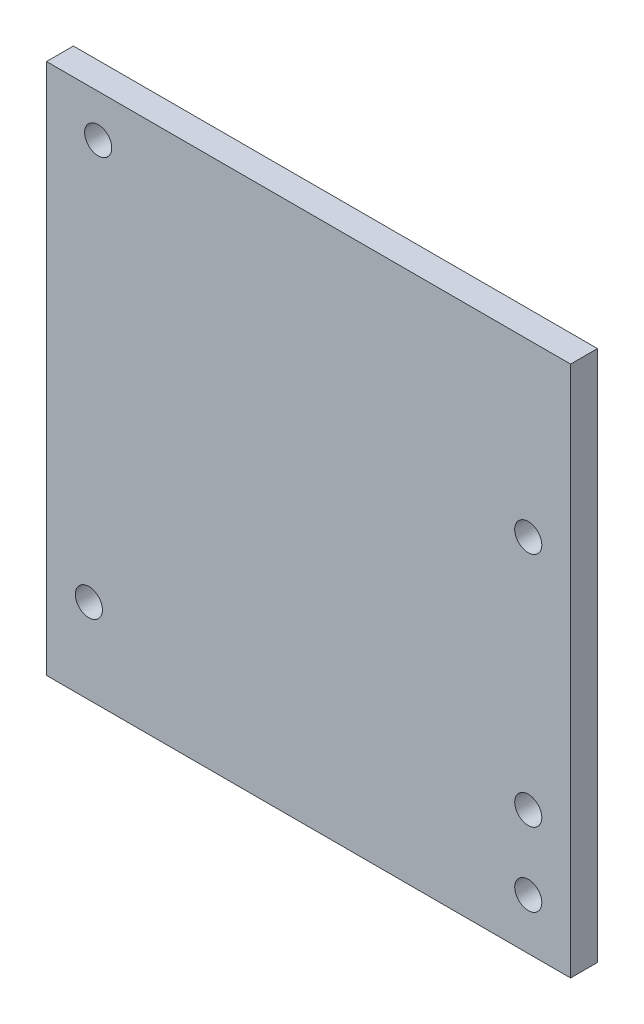
ISO-10303-21;
HEADER;
FILE_DESCRIPTION(('STEP AP214'),'2;1');
FILE_NAME('part.step','',(''),(''),'','','');
FILE_SCHEMA(('AUTOMOTIVE_DESIGN { 1 0 10303 214 1 1 1 1 }'));
ENDSEC;
DATA;
#1=APPLICATION_CONTEXT('core data for automotive mechanical design processes');
#2=APPLICATION_PROTOCOL_DEFINITION('international standard','automotive_design',2000,#1);
#3=PRODUCT_CONTEXT('',#1,'mechanical');
#4=PRODUCT('Part','Part','',(#3));
#5=PRODUCT_RELATED_PRODUCT_CATEGORY('part','',(#4));
#6=PRODUCT_DEFINITION_FORMATION('','',#4);
#7=PRODUCT_DEFINITION_CONTEXT('part definition',#1,'design');
#8=PRODUCT_DEFINITION('design','',#6,#7);
#9=PRODUCT_DEFINITION_SHAPE('','',#8);
#10=(LENGTH_UNIT() NAMED_UNIT(*) SI_UNIT(.MILLI.,.METRE.));
#11=(NAMED_UNIT(*) PLANE_ANGLE_UNIT() SI_UNIT($,.RADIAN.));
#12=(NAMED_UNIT(*) SI_UNIT($,.STERADIAN.) SOLID_ANGLE_UNIT());
#13=UNCERTAINTY_MEASURE_WITH_UNIT(LENGTH_MEASURE(1.E-05),#10,'distance_accuracy_value','');
#14=(GEOMETRIC_REPRESENTATION_CONTEXT(3) GLOBAL_UNCERTAINTY_ASSIGNED_CONTEXT((#13)) GLOBAL_UNIT_ASSIGNED_CONTEXT((#10,
#11,#12)) REPRESENTATION_CONTEXT('',''));
#15=CARTESIAN_POINT('',(0.,0.,0.));
#16=DIRECTION('',(0.,0.,1.));
#17=DIRECTION('',(1.,0.,0.));
#18=AXIS2_PLACEMENT_3D('',#15,#16,#17);
#19=CARTESIAN_POINT('',(0.,0.,3.175));
#20=DIRECTION('',(0.,0.,-1.));
#21=DIRECTION('',(-1.,0.,0.));
#22=AXIS2_PLACEMENT_3D('',#19,#20,#21);
#23=PLANE('',#22);
#24=DIRECTION('',(0.,-1.,0.));
#25=VECTOR('',#24,1.);
#26=CARTESIAN_POINT('',(0.,0.,3.175));
#27=LINE('',#26,#25);
#28=CARTESIAN_POINT('',(0.,62.8,3.175));
#29=VERTEX_POINT('',#28);
#30=CARTESIAN_POINT('',(0.,0.,3.175));
#31=VERTEX_POINT('',#30);
#32=EDGE_CURVE('E85',#29,#31,#27,.T.);
#33=ORIENTED_EDGE('',*,*,#32,.T.);
#34=DIRECTION('',(1.,0.,0.));
#35=VECTOR('',#34,1.);
#36=CARTESIAN_POINT('',(0.,0.,3.175));
#37=LINE('',#36,#35);
#38=CARTESIAN_POINT('',(61.9,0.,3.175));
#39=VERTEX_POINT('',#38);
#40=EDGE_CURVE('E80',#31,#39,#37,.T.);
#41=ORIENTED_EDGE('',*,*,#40,.T.);
#42=DIRECTION('',(0.,1.,0.));
#43=VECTOR('',#42,1.);
#44=CARTESIAN_POINT('',(61.9,0.,3.175));
#45=LINE('',#44,#43);
#46=CARTESIAN_POINT('',(61.9,62.8,3.175));
#47=VERTEX_POINT('',#46);
#48=EDGE_CURVE('E83',#39,#47,#45,.T.);
#49=ORIENTED_EDGE('',*,*,#48,.T.);
#50=DIRECTION('',(-1.,0.,0.));
#51=VECTOR('',#50,1.);
#52=CARTESIAN_POINT('',(0.,62.8,3.175));
#53=LINE('',#52,#51);
#54=EDGE_CURVE('E50',#47,#29,#53,.T.);
#55=ORIENTED_EDGE('',*,*,#54,.T.);
#56=EDGE_LOOP('',(#33,#41,#49,#55));
#57=FACE_BOUND('',#56,.T.);
#58=CARTESIAN_POINT('',(6.09999999999997,57.8,3.175));
#59=DIRECTION('',(0.,0.,1.));
#60=DIRECTION('',(1.,0.,0.));
#61=AXIS2_PLACEMENT_3D('',#58,#59,#60);
#62=CIRCLE('',#61,1.60000000000001);
#63=CARTESIAN_POINT('',(7.69999999999998,57.8,3.175));
#64=VERTEX_POINT('',#63);
#65=EDGE_CURVE('E100',#64,#64,#62,.T.);
#66=ORIENTED_EDGE('',*,*,#65,.F.);
#67=EDGE_LOOP('',(#66));
#68=FACE_BOUND('',#67,.T.);
#69=CARTESIAN_POINT('',(5.,10.,3.175));
#70=DIRECTION('',(0.,0.,1.));
#71=DIRECTION('',(1.,0.,0.));
#72=AXIS2_PLACEMENT_3D('',#69,#70,#71);
#73=CIRCLE('',#72,1.6);
#74=CARTESIAN_POINT('',(6.6,10.,3.175));
#75=VERTEX_POINT('',#74);
#76=EDGE_CURVE('E115',#75,#75,#73,.T.);
#77=ORIENTED_EDGE('',*,*,#76,.F.);
#78=EDGE_LOOP('',(#77));
#79=FACE_BOUND('',#78,.T.);
#80=CARTESIAN_POINT('',(56.9,42.6,3.175));
#81=DIRECTION('',(0.,0.,1.));
#82=DIRECTION('',(1.,0.,0.));
#83=AXIS2_PLACEMENT_3D('',#80,#81,#82);
#84=CIRCLE('',#83,1.60000000000001);
#85=CARTESIAN_POINT('',(58.5,42.6,3.175));
#86=VERTEX_POINT('',#85);
#87=EDGE_CURVE('E121',#86,#86,#84,.T.);
#88=ORIENTED_EDGE('',*,*,#87,.F.);
#89=EDGE_LOOP('',(#88));
#90=FACE_BOUND('',#89,.T.);
#91=CARTESIAN_POINT('',(56.9,14.7,3.175));
#92=DIRECTION('',(0.,0.,1.));
#93=DIRECTION('',(1.,0.,0.));
#94=AXIS2_PLACEMENT_3D('',#91,#92,#93);
#95=CIRCLE('',#94,1.6);
#96=CARTESIAN_POINT('',(58.5,14.7,3.175));
#97=VERTEX_POINT('',#96);
#98=EDGE_CURVE('E127',#97,#97,#95,.T.);
#99=ORIENTED_EDGE('',*,*,#98,.F.);
#100=EDGE_LOOP('',(#99));
#101=FACE_BOUND('',#100,.T.);
#102=CARTESIAN_POINT('',(56.9,6.,3.175));
#103=DIRECTION('',(0.,0.,1.));
#104=DIRECTION('',(1.,0.,0.));
#105=AXIS2_PLACEMENT_3D('',#102,#103,#104);
#106=CIRCLE('',#105,1.6);
#107=CARTESIAN_POINT('',(58.5,6.,3.175));
#108=VERTEX_POINT('',#107);
#109=EDGE_CURVE('E133',#108,#108,#106,.T.);
#110=ORIENTED_EDGE('',*,*,#109,.F.);
#111=EDGE_LOOP('',(#110));
#112=FACE_BOUND('',#111,.T.);
#113=ADVANCED_FACE('F33',(#57,#68,#79,#90,#101,#112),#23,.F.);
#114=CARTESIAN_POINT('',(0.,0.,0.));
#115=DIRECTION('',(0.,0.,-1.));
#116=DIRECTION('',(-1.,0.,0.));
#117=AXIS2_PLACEMENT_3D('',#114,#115,#116);
#118=PLANE('',#117);
#119=CARTESIAN_POINT('',(56.9,14.7,0.));
#120=DIRECTION('',(0.,0.,1.));
#121=DIRECTION('',(1.,0.,0.));
#122=AXIS2_PLACEMENT_3D('',#119,#120,#121);
#123=CIRCLE('',#122,1.6);
#124=CARTESIAN_POINT('',(58.5,14.7,0.));
#125=VERTEX_POINT('',#124);
#126=EDGE_CURVE('E130',#125,#125,#123,.T.);
#127=ORIENTED_EDGE('',*,*,#126,.T.);
#128=EDGE_LOOP('',(#127));
#129=FACE_BOUND('',#128,.T.);
#130=CARTESIAN_POINT('',(5.,10.,0.));
#131=DIRECTION('',(0.,0.,1.));
#132=DIRECTION('',(1.,0.,0.));
#133=AXIS2_PLACEMENT_3D('',#130,#131,#132);
#134=CIRCLE('',#133,1.6);
#135=CARTESIAN_POINT('',(6.6,10.,0.));
#136=VERTEX_POINT('',#135);
#137=EDGE_CURVE('E118',#136,#136,#134,.T.);
#138=ORIENTED_EDGE('',*,*,#137,.T.);
#139=EDGE_LOOP('',(#138));
#140=FACE_BOUND('',#139,.T.);
#141=DIRECTION('',(0.,-1.,0.));
#142=VECTOR('',#141,1.);
#143=CARTESIAN_POINT('',(0.,0.,0.));
#144=LINE('',#143,#142);
#145=CARTESIAN_POINT('',(0.,62.8,0.));
#146=VERTEX_POINT('',#145);
#147=CARTESIAN_POINT('',(0.,0.,0.));
#148=VERTEX_POINT('',#147);
#149=EDGE_CURVE('E97',#146,#148,#144,.T.);
#150=ORIENTED_EDGE('',*,*,#149,.F.);
#151=DIRECTION('',(-1.,0.,0.));
#152=VECTOR('',#151,1.);
#153=CARTESIAN_POINT('',(0.,62.8,0.));
#154=LINE('',#153,#152);
#155=CARTESIAN_POINT('',(61.9,62.8,0.));
#156=VERTEX_POINT('',#155);
#157=EDGE_CURVE('E73',#156,#146,#154,.T.);
#158=ORIENTED_EDGE('',*,*,#157,.F.);
#159=DIRECTION('',(0.,1.,0.));
#160=VECTOR('',#159,1.);
#161=CARTESIAN_POINT('',(61.9,0.,0.));
#162=LINE('',#161,#160);
#163=CARTESIAN_POINT('',(61.9,0.,0.));
#164=VERTEX_POINT('',#163);
#165=EDGE_CURVE('E67',#164,#156,#162,.T.);
#166=ORIENTED_EDGE('',*,*,#165,.F.);
#167=DIRECTION('',(1.,0.,0.));
#168=VECTOR('',#167,1.);
#169=CARTESIAN_POINT('',(0.,0.,0.));
#170=LINE('',#169,#168);
#171=EDGE_CURVE('E89',#148,#164,#170,.T.);
#172=ORIENTED_EDGE('',*,*,#171,.F.);
#173=EDGE_LOOP('',(#150,#158,#166,#172));
#174=FACE_BOUND('',#173,.T.);
#175=CARTESIAN_POINT('',(6.09999999999997,57.8,0.));
#176=DIRECTION('',(0.,0.,1.));
#177=DIRECTION('',(1.,0.,0.));
#178=AXIS2_PLACEMENT_3D('',#175,#176,#177);
#179=CIRCLE('',#178,1.60000000000001);
#180=CARTESIAN_POINT('',(7.69999999999998,57.8,0.));
#181=VERTEX_POINT('',#180);
#182=EDGE_CURVE('E112',#181,#181,#179,.T.);
#183=ORIENTED_EDGE('',*,*,#182,.T.);
#184=EDGE_LOOP('',(#183));
#185=FACE_BOUND('',#184,.T.);
#186=CARTESIAN_POINT('',(56.9,42.6,0.));
#187=DIRECTION('',(0.,0.,1.));
#188=DIRECTION('',(1.,0.,0.));
#189=AXIS2_PLACEMENT_3D('',#186,#187,#188);
#190=CIRCLE('',#189,1.60000000000001);
#191=CARTESIAN_POINT('',(58.5,42.6,0.));
#192=VERTEX_POINT('',#191);
#193=EDGE_CURVE('E124',#192,#192,#190,.T.);
#194=ORIENTED_EDGE('',*,*,#193,.T.);
#195=EDGE_LOOP('',(#194));
#196=FACE_BOUND('',#195,.T.);
#197=CARTESIAN_POINT('',(56.9,6.,0.));
#198=DIRECTION('',(0.,0.,1.));
#199=DIRECTION('',(1.,0.,0.));
#200=AXIS2_PLACEMENT_3D('',#197,#198,#199);
#201=CIRCLE('',#200,1.6);
#202=CARTESIAN_POINT('',(58.5,6.,0.));
#203=VERTEX_POINT('',#202);
#204=EDGE_CURVE('E136',#203,#203,#201,.T.);
#205=ORIENTED_EDGE('',*,*,#204,.T.);
#206=EDGE_LOOP('',(#205));
#207=FACE_BOUND('',#206,.T.);
#208=ADVANCED_FACE('F108',(#129,#140,#174,#185,#196,#207),#118,.T.);
#209=CARTESIAN_POINT('',(0.,0.,3.175));
#210=DIRECTION('',(1.,0.,0.));
#211=DIRECTION('',(0.,0.,-1.));
#212=AXIS2_PLACEMENT_3D('',#209,#210,#211);
#213=PLANE('',#212);
#214=ORIENTED_EDGE('',*,*,#149,.T.);
#215=DIRECTION('',(0.,0.,-1.));
#216=VECTOR('',#215,1.);
#217=CARTESIAN_POINT('',(0.,0.,3.175));
#218=LINE('',#217,#216);
#219=EDGE_CURVE('E11',#31,#148,#218,.T.);
#220=ORIENTED_EDGE('',*,*,#219,.F.);
#221=ORIENTED_EDGE('',*,*,#32,.F.);
#222=DIRECTION('',(0.,0.,-1.));
#223=VECTOR('',#222,1.);
#224=CARTESIAN_POINT('',(0.,62.8,3.175));
#225=LINE('',#224,#223);
#226=EDGE_CURVE('E93',#29,#146,#225,.T.);
#227=ORIENTED_EDGE('',*,*,#226,.T.);
#228=EDGE_LOOP('',(#214,#220,#221,#227));
#229=FACE_BOUND('',#228,.T.);
#230=ADVANCED_FACE('F35',(#229),#213,.F.);
#231=CARTESIAN_POINT('',(0.,0.,3.175));
#232=DIRECTION('',(0.,1.,0.));
#233=DIRECTION('',(0.,0.,1.));
#234=AXIS2_PLACEMENT_3D('',#231,#232,#233);
#235=PLANE('',#234);
#236=ORIENTED_EDGE('',*,*,#171,.T.);
#237=DIRECTION('',(0.,0.,-1.));
#238=VECTOR('',#237,1.);
#239=CARTESIAN_POINT('',(61.9,0.,3.175));
#240=LINE('',#239,#238);
#241=EDGE_CURVE('E42',#39,#164,#240,.T.);
#242=ORIENTED_EDGE('',*,*,#241,.F.);
#243=ORIENTED_EDGE('',*,*,#40,.F.);
#244=ORIENTED_EDGE('',*,*,#219,.T.);
#245=EDGE_LOOP('',(#236,#242,#243,#244));
#246=FACE_BOUND('',#245,.T.);
#247=ADVANCED_FACE('F88',(#246),#235,.F.);
#248=CARTESIAN_POINT('',(61.9,0.,3.175));
#249=DIRECTION('',(-1.,0.,0.));
#250=DIRECTION('',(0.,-1.,0.));
#251=AXIS2_PLACEMENT_3D('',#248,#249,#250);
#252=PLANE('',#251);
#253=ORIENTED_EDGE('',*,*,#165,.T.);
#254=DIRECTION('',(0.,0.,-1.));
#255=VECTOR('',#254,1.);
#256=CARTESIAN_POINT('',(61.9,62.8,3.175));
#257=LINE('',#256,#255);
#258=EDGE_CURVE('E90',#47,#156,#257,.T.);
#259=ORIENTED_EDGE('',*,*,#258,.F.);
#260=ORIENTED_EDGE('',*,*,#48,.F.);
#261=ORIENTED_EDGE('',*,*,#241,.T.);
#262=EDGE_LOOP('',(#253,#259,#260,#261));
#263=FACE_BOUND('',#262,.T.);
#264=ADVANCED_FACE('F91',(#263),#252,.F.);
#265=CARTESIAN_POINT('',(0.,62.8,3.175));
#266=DIRECTION('',(0.,-1.,0.));
#267=DIRECTION('',(0.,0.,-1.));
#268=AXIS2_PLACEMENT_3D('',#265,#266,#267);
#269=PLANE('',#268);
#270=ORIENTED_EDGE('',*,*,#157,.T.);
#271=ORIENTED_EDGE('',*,*,#226,.F.);
#272=ORIENTED_EDGE('',*,*,#54,.F.);
#273=ORIENTED_EDGE('',*,*,#258,.T.);
#274=EDGE_LOOP('',(#270,#271,#272,#273));
#275=FACE_BOUND('',#274,.T.);
#276=ADVANCED_FACE('F105',(#275),#269,.F.);
#277=CARTESIAN_POINT('',(6.09999999999997,57.8,3.175));
#278=DIRECTION('',(0.,0.,-1.));
#279=DIRECTION('',(-1.,0.,0.));
#280=AXIS2_PLACEMENT_3D('',#277,#278,#279);
#281=CYLINDRICAL_SURFACE('',#280,1.60000000000001);
#282=ORIENTED_EDGE('',*,*,#65,.T.);
#283=EDGE_LOOP('',(#282));
#284=FACE_BOUND('',#283,.T.);
#285=ORIENTED_EDGE('',*,*,#182,.F.);
#286=EDGE_LOOP('',(#285));
#287=FACE_BOUND('',#286,.T.);
#288=ADVANCED_FACE('F153',(#284,#287),#281,.F.);
#289=CARTESIAN_POINT('',(5.,10.,3.175));
#290=DIRECTION('',(0.,0.,-1.));
#291=DIRECTION('',(-1.,0.,0.));
#292=AXIS2_PLACEMENT_3D('',#289,#290,#291);
#293=CYLINDRICAL_SURFACE('',#292,1.6);
#294=ORIENTED_EDGE('',*,*,#76,.T.);
#295=EDGE_LOOP('',(#294));
#296=FACE_BOUND('',#295,.T.);
#297=ORIENTED_EDGE('',*,*,#137,.F.);
#298=EDGE_LOOP('',(#297));
#299=FACE_BOUND('',#298,.T.);
#300=ADVANCED_FACE('F199',(#296,#299),#293,.F.);
#301=CARTESIAN_POINT('',(56.9,42.6,3.175));
#302=DIRECTION('',(0.,0.,-1.));
#303=DIRECTION('',(-1.,0.,0.));
#304=AXIS2_PLACEMENT_3D('',#301,#302,#303);
#305=CYLINDRICAL_SURFACE('',#304,1.60000000000001);
#306=ORIENTED_EDGE('',*,*,#87,.T.);
#307=EDGE_LOOP('',(#306));
#308=FACE_BOUND('',#307,.T.);
#309=ORIENTED_EDGE('',*,*,#193,.F.);
#310=EDGE_LOOP('',(#309));
#311=FACE_BOUND('',#310,.T.);
#312=ADVANCED_FACE('F207',(#308,#311),#305,.F.);
#313=CARTESIAN_POINT('',(56.9,14.7,3.175));
#314=DIRECTION('',(0.,0.,-1.));
#315=DIRECTION('',(-1.,0.,0.));
#316=AXIS2_PLACEMENT_3D('',#313,#314,#315);
#317=CYLINDRICAL_SURFACE('',#316,1.6);
#318=ORIENTED_EDGE('',*,*,#98,.T.);
#319=EDGE_LOOP('',(#318));
#320=FACE_BOUND('',#319,.T.);
#321=ORIENTED_EDGE('',*,*,#126,.F.);
#322=EDGE_LOOP('',(#321));
#323=FACE_BOUND('',#322,.T.);
#324=ADVANCED_FACE('F215',(#320,#323),#317,.F.);
#325=CARTESIAN_POINT('',(56.9,6.,3.175));
#326=DIRECTION('',(0.,0.,-1.));
#327=DIRECTION('',(-1.,0.,0.));
#328=AXIS2_PLACEMENT_3D('',#325,#326,#327);
#329=CYLINDRICAL_SURFACE('',#328,1.6);
#330=ORIENTED_EDGE('',*,*,#109,.T.);
#331=EDGE_LOOP('',(#330));
#332=FACE_BOUND('',#331,.T.);
#333=ORIENTED_EDGE('',*,*,#204,.F.);
#334=EDGE_LOOP('',(#333));
#335=FACE_BOUND('',#334,.T.);
#336=ADVANCED_FACE('F142',(#332,#335),#329,.F.);
#337=CLOSED_SHELL('',(#113,#208,#230,#247,#264,#276,#288,#300,#312,#324,#336));
#338=MANIFOLD_SOLID_BREP('B2',#337);
#339=ADVANCED_BREP_SHAPE_REPRESENTATION('',(#18,#338),#14);
#340=SHAPE_DEFINITION_REPRESENTATION(#9,#339);
ENDSEC;
END-ISO-10303-21;
